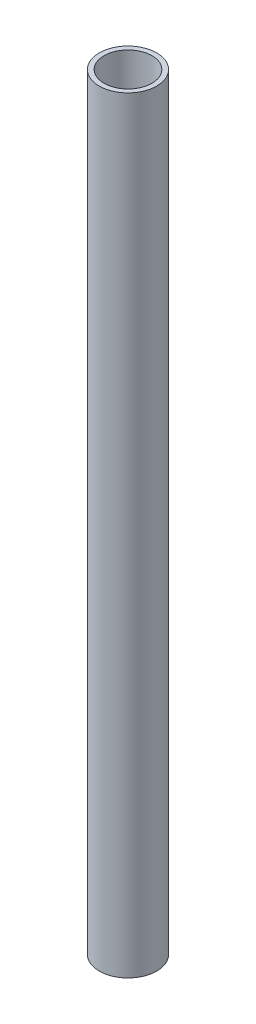
ISO-10303-21;
HEADER;
FILE_DESCRIPTION(('STEP AP214'),'2;1');
FILE_NAME('part.step','',(''),(''),'','','');
FILE_SCHEMA(('AUTOMOTIVE_DESIGN { 1 0 10303 214 1 1 1 1 }'));
ENDSEC;
DATA;
#1=APPLICATION_CONTEXT('core data for automotive mechanical design processes');
#2=APPLICATION_PROTOCOL_DEFINITION('international standard','automotive_design',2000,#1);
#3=PRODUCT_CONTEXT('',#1,'mechanical');
#4=PRODUCT('Part','Part','',(#3));
#5=PRODUCT_RELATED_PRODUCT_CATEGORY('part','',(#4));
#6=PRODUCT_DEFINITION_FORMATION('','',#4);
#7=PRODUCT_DEFINITION_CONTEXT('part definition',#1,'design');
#8=PRODUCT_DEFINITION('design','',#6,#7);
#9=PRODUCT_DEFINITION_SHAPE('','',#8);
#10=(LENGTH_UNIT() NAMED_UNIT(*) SI_UNIT(.MILLI.,.METRE.));
#11=(NAMED_UNIT(*) PLANE_ANGLE_UNIT() SI_UNIT($,.RADIAN.));
#12=(NAMED_UNIT(*) SI_UNIT($,.STERADIAN.) SOLID_ANGLE_UNIT());
#13=UNCERTAINTY_MEASURE_WITH_UNIT(LENGTH_MEASURE(1.E-05),#10,'distance_accuracy_value','');
#14=(GEOMETRIC_REPRESENTATION_CONTEXT(3) GLOBAL_UNCERTAINTY_ASSIGNED_CONTEXT((#13)) GLOBAL_UNIT_ASSIGNED_CONTEXT((#10,
#11,#12)) REPRESENTATION_CONTEXT('',''));
#15=CARTESIAN_POINT('',(0.,0.,0.));
#16=DIRECTION('',(0.,0.,1.));
#17=DIRECTION('',(1.,0.,0.));
#18=AXIS2_PLACEMENT_3D('',#15,#16,#17);
#19=CARTESIAN_POINT('',(0.,101.6,0.));
#20=DIRECTION('',(0.,1.,0.));
#21=DIRECTION('',(0.,0.,1.));
#22=AXIS2_PLACEMENT_3D('',#19,#20,#21);
#23=PLANE('',#22);
#24=CARTESIAN_POINT('',(0.,101.6,0.));
#25=DIRECTION('',(0.,1.,0.));
#26=DIRECTION('',(0.,0.,1.));
#27=AXIS2_PLACEMENT_3D('',#24,#25,#26);
#28=CIRCLE('',#27,3.81);
#29=CARTESIAN_POINT('',(0.,101.6,3.81));
#30=VERTEX_POINT('',#29);
#31=EDGE_CURVE('E10',#30,#30,#28,.T.);
#32=ORIENTED_EDGE('',*,*,#31,.T.);
#33=EDGE_LOOP('',(#32));
#34=FACE_BOUND('',#33,.T.);
#35=CARTESIAN_POINT('',(0.,101.6,0.));
#36=DIRECTION('',(0.,1.,0.));
#37=DIRECTION('',(0.,0.,1.));
#38=AXIS2_PLACEMENT_3D('',#35,#36,#37);
#39=CIRCLE('',#38,3.175);
#40=CARTESIAN_POINT('',(0.,101.6,3.175));
#41=VERTEX_POINT('',#40);
#42=EDGE_CURVE('E54',#41,#41,#39,.T.);
#43=ORIENTED_EDGE('',*,*,#42,.F.);
#44=EDGE_LOOP('',(#43));
#45=FACE_BOUND('',#44,.T.);
#46=ADVANCED_FACE('F41',(#34,#45),#23,.T.);
#47=CARTESIAN_POINT('',(0.,0.,0.));
#48=DIRECTION('',(0.,1.,0.));
#49=DIRECTION('',(0.,0.,1.));
#50=AXIS2_PLACEMENT_3D('',#47,#48,#49);
#51=PLANE('',#50);
#52=CARTESIAN_POINT('',(0.,0.,0.));
#53=DIRECTION('',(0.,1.,0.));
#54=DIRECTION('',(0.,0.,1.));
#55=AXIS2_PLACEMENT_3D('',#52,#53,#54);
#56=CIRCLE('',#55,3.81);
#57=CARTESIAN_POINT('',(0.,0.,3.81));
#58=VERTEX_POINT('',#57);
#59=EDGE_CURVE('E45',#58,#58,#56,.T.);
#60=ORIENTED_EDGE('',*,*,#59,.F.);
#61=EDGE_LOOP('',(#60));
#62=FACE_BOUND('',#61,.T.);
#63=CARTESIAN_POINT('',(0.,0.,0.));
#64=DIRECTION('',(0.,1.,0.));
#65=DIRECTION('',(0.,0.,1.));
#66=AXIS2_PLACEMENT_3D('',#63,#64,#65);
#67=CIRCLE('',#66,3.175);
#68=CARTESIAN_POINT('',(0.,0.,3.175));
#69=VERTEX_POINT('',#68);
#70=EDGE_CURVE('E56',#69,#69,#67,.T.);
#71=ORIENTED_EDGE('',*,*,#70,.T.);
#72=EDGE_LOOP('',(#71));
#73=FACE_BOUND('',#72,.T.);
#74=ADVANCED_FACE('F68',(#62,#73),#51,.F.);
#75=CARTESIAN_POINT('',(0.,101.6,0.));
#76=DIRECTION('',(0.,-1.,0.));
#77=DIRECTION('',(0.,0.,-1.));
#78=AXIS2_PLACEMENT_3D('',#75,#76,#77);
#79=CYLINDRICAL_SURFACE('',#78,3.81);
#80=ORIENTED_EDGE('',*,*,#31,.F.);
#81=EDGE_LOOP('',(#80));
#82=FACE_BOUND('',#81,.T.);
#83=ORIENTED_EDGE('',*,*,#59,.T.);
#84=EDGE_LOOP('',(#83));
#85=FACE_BOUND('',#84,.T.);
#86=ADVANCED_FACE('F43',(#82,#85),#79,.T.);
#87=CARTESIAN_POINT('',(0.,101.6,0.));
#88=DIRECTION('',(0.,-1.,0.));
#89=DIRECTION('',(0.,0.,-1.));
#90=AXIS2_PLACEMENT_3D('',#87,#88,#89);
#91=CYLINDRICAL_SURFACE('',#90,3.175);
#92=ORIENTED_EDGE('',*,*,#42,.T.);
#93=EDGE_LOOP('',(#92));
#94=FACE_BOUND('',#93,.T.);
#95=ORIENTED_EDGE('',*,*,#70,.F.);
#96=EDGE_LOOP('',(#95));
#97=FACE_BOUND('',#96,.T.);
#98=ADVANCED_FACE('F64',(#94,#97),#91,.F.);
#99=CLOSED_SHELL('',(#46,#74,#86,#98));
#100=MANIFOLD_SOLID_BREP('B2',#99);
#101=ADVANCED_BREP_SHAPE_REPRESENTATION('',(#18,#100),#14);
#102=SHAPE_DEFINITION_REPRESENTATION(#9,#101);
ENDSEC;
END-ISO-10303-21;
